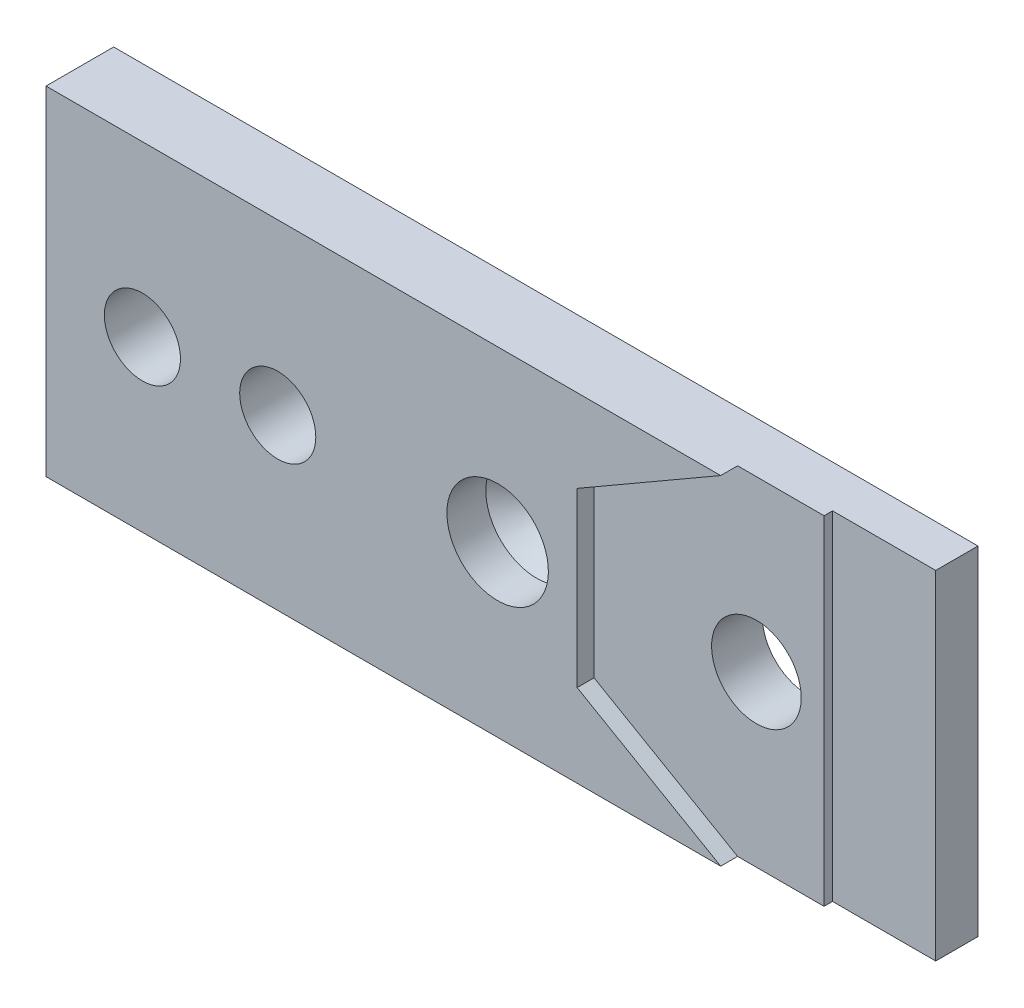
ISO-10303-21;
HEADER;
FILE_DESCRIPTION(('STEP AP214'),'2;1');
FILE_NAME('part.step','',(''),(''),'','','');
FILE_SCHEMA(('AUTOMOTIVE_DESIGN { 1 0 10303 214 1 1 1 1 }'));
ENDSEC;
DATA;
#1=APPLICATION_CONTEXT('core data for automotive mechanical design processes');
#2=APPLICATION_PROTOCOL_DEFINITION('international standard','automotive_design',2000,#1);
#3=PRODUCT_CONTEXT('',#1,'mechanical');
#4=PRODUCT('Part','Part','',(#3));
#5=PRODUCT_RELATED_PRODUCT_CATEGORY('part','',(#4));
#6=PRODUCT_DEFINITION_FORMATION('','',#4);
#7=PRODUCT_DEFINITION_CONTEXT('part definition',#1,'design');
#8=PRODUCT_DEFINITION('design','',#6,#7);
#9=PRODUCT_DEFINITION_SHAPE('','',#8);
#10=(LENGTH_UNIT() NAMED_UNIT(*) SI_UNIT(.MILLI.,.METRE.));
#11=(NAMED_UNIT(*) PLANE_ANGLE_UNIT() SI_UNIT($,.RADIAN.));
#12=(NAMED_UNIT(*) SI_UNIT($,.STERADIAN.) SOLID_ANGLE_UNIT());
#13=UNCERTAINTY_MEASURE_WITH_UNIT(LENGTH_MEASURE(1.E-05),#10,'distance_accuracy_value','');
#14=(GEOMETRIC_REPRESENTATION_CONTEXT(3) GLOBAL_UNCERTAINTY_ASSIGNED_CONTEXT((#13)) GLOBAL_UNIT_ASSIGNED_CONTEXT((#10,
#11,#12)) REPRESENTATION_CONTEXT('',''));
#15=CARTESIAN_POINT('',(0.,0.,0.));
#16=DIRECTION('',(0.,0.,1.));
#17=DIRECTION('',(1.,0.,0.));
#18=AXIS2_PLACEMENT_3D('',#15,#16,#17);
#19=CARTESIAN_POINT('',(26.7,1.49999999998826,18.9953318805774));
#20=DIRECTION('',(0.,1.30506716544687E-12,-1.));
#21=DIRECTION('',(0.,1.,1.30506716544687E-12));
#22=AXIS2_PLACEMENT_3D('',#19,#20,#21);
#23=CYLINDRICAL_SURFACE('',#22,1.65);
#24=CARTESIAN_POINT('',(26.7,1.50000000000196,8.49999999999999));
#25=DIRECTION('',(0.,1.30506716544687E-12,-1.));
#26=DIRECTION('',(0.,1.,1.30506716544687E-12));
#27=AXIS2_PLACEMENT_3D('',#24,#25,#26);
#28=CIRCLE('',#27,1.65);
#29=CARTESIAN_POINT('',(26.7,3.15000000000196,8.50000000000215));
#30=VERTEX_POINT('',#29);
#31=EDGE_CURVE('E194',#30,#30,#28,.T.);
#32=ORIENTED_EDGE('',*,*,#31,.T.);
#33=EDGE_LOOP('',(#32));
#34=FACE_BOUND('',#33,.T.);
#35=CARTESIAN_POINT('',(26.7,1.5000000000015,8.84999999999999));
#36=DIRECTION('',(0.,-1.30506716544687E-12,1.));
#37=DIRECTION('',(0.,-1.,-1.30506716544687E-12));
#38=AXIS2_PLACEMENT_3D('',#35,#36,#37);
#39=CIRCLE('',#38,1.65);
#40=CARTESIAN_POINT('',(26.7,-0.149999999998496,8.84999999999784));
#41=VERTEX_POINT('',#40);
#42=EDGE_CURVE('E39',#41,#41,#39,.F.);
#43=ORIENTED_EDGE('',*,*,#42,.F.);
#44=EDGE_LOOP('',(#43));
#45=FACE_BOUND('',#44,.T.);
#46=ADVANCED_FACE('F35',(#34,#45),#23,.F.);
#47=CARTESIAN_POINT('',(0.,-8.50000000000326,12.4999999999869));
#48=DIRECTION('',(0.,-1.30506716544687E-12,1.));
#49=DIRECTION('',(0.,-1.,-1.30506716544687E-12));
#50=AXIS2_PLACEMENT_3D('',#47,#48,#49);
#51=PLANE('',#50);
#52=DIRECTION('',(0.,-1.,-1.30506716544687E-12));
#53=VECTOR('',#52,1.);
#54=CARTESIAN_POINT('',(0.,1.51831648704547,12.5));
#55=LINE('',#54,#53);
#56=CARTESIAN_POINT('',(0.,11.4999999999967,12.500000000013));
#57=VERTEX_POINT('',#56);
#58=CARTESIAN_POINT('',(0.,-8.50000000000326,12.4999999999869));
#59=VERTEX_POINT('',#58);
#60=EDGE_CURVE('E165',#57,#59,#55,.T.);
#61=ORIENTED_EDGE('',*,*,#60,.T.);
#62=DIRECTION('',(1.,0.,0.));
#63=VECTOR('',#62,1.);
#64=CARTESIAN_POINT('',(-17.0919216022043,-8.50000000000326,12.4999999999869));
#65=LINE('',#64,#63);
#66=CARTESIAN_POINT('',(39.8870489570875,-8.50000000000326,12.4999999999869));
#67=VERTEX_POINT('',#66);
#68=EDGE_CURVE('E160',#59,#67,#65,.T.);
#69=ORIENTED_EDGE('',*,*,#68,.T.);
#70=DIRECTION('',(0.86602540378444,-0.499999999999997,-6.52533582723432E-13));
#71=VECTOR('',#70,1.);
#72=CARTESIAN_POINT('',(-7.18523725284984,18.677197114675,12.5000000000224));
#73=LINE('',#72,#71);
#74=CARTESIAN_POINT('',(31.4,-3.60000000000326,12.4999999999933));
#75=VERTEX_POINT('',#74);
#76=EDGE_CURVE('E149',#75,#67,#73,.T.);
#77=ORIENTED_EDGE('',*,*,#76,.F.);
#78=DIRECTION('',(0.,-1.,-1.30506716544687E-12));
#79=VECTOR('',#78,1.);
#80=CARTESIAN_POINT('',(31.4,1.51831648704547,12.5));
#81=LINE('',#80,#79);
#82=CARTESIAN_POINT('',(31.4,6.59999999999674,12.5000000000067));
#83=VERTEX_POINT('',#82);
#84=EDGE_CURVE('E148',#83,#75,#81,.T.);
#85=ORIENTED_EDGE('',*,*,#84,.F.);
#86=DIRECTION('',(-0.86602540378444,-0.499999999999998,-6.52533582723433E-13));
#87=VECTOR('',#86,1.);
#88=CARTESIAN_POINT('',(-7.16937470975751,-15.6680388711572,12.4999999999776));
#89=LINE('',#88,#87);
#90=CARTESIAN_POINT('',(39.8870489570875,11.4999999999967,12.500000000013));
#91=VERTEX_POINT('',#90);
#92=EDGE_CURVE('E170',#91,#83,#89,.T.);
#93=ORIENTED_EDGE('',*,*,#92,.F.);
#94=DIRECTION('',(-1.,0.,0.));
#95=VECTOR('',#94,1.);
#96=CARTESIAN_POINT('',(-17.0919216022043,11.4999999999967,12.500000000013));
#97=LINE('',#96,#95);
#98=EDGE_CURVE('E164',#91,#57,#97,.T.);
#99=ORIENTED_EDGE('',*,*,#98,.T.);
#100=EDGE_LOOP('',(#61,#69,#77,#85,#93,#99));
#101=FACE_BOUND('',#100,.T.);
#102=CARTESIAN_POINT('',(13.7,1.49999999999674,12.5));
#103=DIRECTION('',(0.,-1.30506716544687E-12,1.));
#104=DIRECTION('',(0.,-1.,-1.30506716544687E-12));
#105=AXIS2_PLACEMENT_3D('',#102,#103,#104);
#106=CIRCLE('',#105,2.25);
#107=CARTESIAN_POINT('',(13.7,-0.750000000003261,12.4999999999971));
#108=VERTEX_POINT('',#107);
#109=EDGE_CURVE('E156',#108,#108,#106,.F.);
#110=ORIENTED_EDGE('',*,*,#109,.T.);
#111=EDGE_LOOP('',(#110));
#112=FACE_BOUND('',#111,.T.);
#113=CARTESIAN_POINT('',(5.69999999999999,1.49999999999674,12.5));
#114=DIRECTION('',(0.,-1.30506716544687E-12,1.));
#115=DIRECTION('',(0.,-1.,-1.30506716544687E-12));
#116=AXIS2_PLACEMENT_3D('',#113,#114,#115);
#117=CIRCLE('',#116,2.25);
#118=CARTESIAN_POINT('',(5.69999999999999,-0.750000000003259,12.4999999999971));
#119=VERTEX_POINT('',#118);
#120=EDGE_CURVE('E161',#119,#119,#117,.F.);
#121=ORIENTED_EDGE('',*,*,#120,.T.);
#122=EDGE_LOOP('',(#121));
#123=FACE_BOUND('',#122,.T.);
#124=CARTESIAN_POINT('',(26.7,1.49999999999674,12.5));
#125=DIRECTION('',(0.,1.30506716544687E-12,-1.));
#126=DIRECTION('',(0.,1.,1.30506716544687E-12));
#127=AXIS2_PLACEMENT_3D('',#124,#125,#126);
#128=CIRCLE('',#127,3.);
#129=CARTESIAN_POINT('',(26.7,4.49999999999674,12.5000000000039));
#130=VERTEX_POINT('',#129);
#131=EDGE_CURVE('E479',#130,#130,#128,.T.);
#132=ORIENTED_EDGE('',*,*,#131,.T.);
#133=EDGE_LOOP('',(#132));
#134=FACE_BOUND('',#133,.T.);
#135=ADVANCED_FACE('F248',(#101,#112,#123,#134),#51,.T.);
#136=CARTESIAN_POINT('',(0.,-8.50000000000195,11.4999999999869));
#137=DIRECTION('',(1.,0.,0.));
#138=DIRECTION('',(0.,-1.30506716544687E-12,1.));
#139=AXIS2_PLACEMENT_3D('',#136,#137,#138);
#140=PLANE('',#139);
#141=DIRECTION('',(0.,1.30506716544687E-12,-1.));
#142=VECTOR('',#141,1.);
#143=CARTESIAN_POINT('',(0.,11.499999999998,11.500000000013));
#144=LINE('',#143,#142);
#145=CARTESIAN_POINT('',(0.,11.500000000002,8.50000000001305));
#146=VERTEX_POINT('',#145);
#147=EDGE_CURVE('E126',#57,#146,#144,.T.);
#148=ORIENTED_EDGE('',*,*,#147,.T.);
#149=DIRECTION('',(0.,1.,1.30506716544687E-12));
#150=VECTOR('',#149,1.);
#151=CARTESIAN_POINT('',(0.,-8.49999999999804,8.49999999998695));
#152=LINE('',#151,#150);
#153=CARTESIAN_POINT('',(0.,-8.49999999999804,8.49999999998695));
#154=VERTEX_POINT('',#153);
#155=EDGE_CURVE('E12',#154,#146,#152,.T.);
#156=ORIENTED_EDGE('',*,*,#155,.F.);
#157=DIRECTION('',(0.,1.30506716544687E-12,-1.));
#158=VECTOR('',#157,1.);
#159=CARTESIAN_POINT('',(0.,-8.50000000000195,11.4999999999869));
#160=LINE('',#159,#158);
#161=EDGE_CURVE('E197',#59,#154,#160,.T.);
#162=ORIENTED_EDGE('',*,*,#161,.F.);
#163=ORIENTED_EDGE('',*,*,#60,.F.);
#164=EDGE_LOOP('',(#148,#156,#162,#163));
#165=FACE_BOUND('',#164,.T.);
#166=ADVANCED_FACE('F37',(#165),#140,.F.);
#167=CARTESIAN_POINT('',(0.,-8.49999999999804,8.49999999998695));
#168=DIRECTION('',(0.,-1.30506716544687E-12,1.));
#169=DIRECTION('',(0.,-1.,-1.30506716544687E-12));
#170=AXIS2_PLACEMENT_3D('',#167,#168,#169);
#171=PLANE('',#170);
#172=CARTESIAN_POINT('',(5.69999999999999,1.50000000000196,8.49999999999999));
#173=DIRECTION('',(0.,1.30506716544687E-12,-1.));
#174=DIRECTION('',(0.,1.,1.30506716544687E-12));
#175=AXIS2_PLACEMENT_3D('',#172,#173,#174);
#176=CIRCLE('',#175,2.25);
#177=CARTESIAN_POINT('',(5.69999999999999,3.75000000000196,8.50000000000293));
#178=VERTEX_POINT('',#177);
#179=EDGE_CURVE('E159',#178,#178,#176,.T.);
#180=ORIENTED_EDGE('',*,*,#179,.F.);
#181=EDGE_LOOP('',(#180));
#182=FACE_BOUND('',#181,.T.);
#183=CARTESIAN_POINT('',(13.7,1.50000000000196,8.49999999999999));
#184=DIRECTION('',(0.,1.30506716544687E-12,-1.));
#185=DIRECTION('',(0.,1.,1.30506716544687E-12));
#186=AXIS2_PLACEMENT_3D('',#183,#184,#185);
#187=CIRCLE('',#186,2.25);
#188=CARTESIAN_POINT('',(13.7,3.75000000000196,8.50000000000293));
#189=VERTEX_POINT('',#188);
#190=EDGE_CURVE('E185',#189,#189,#187,.T.);
#191=ORIENTED_EDGE('',*,*,#190,.F.);
#192=EDGE_LOOP('',(#191));
#193=FACE_BOUND('',#192,.T.);
#194=CARTESIAN_POINT('',(41.,1.50000000000196,8.49999999999999));
#195=DIRECTION('',(0.,1.30506716544687E-12,-1.));
#196=DIRECTION('',(0.,1.,1.30506716544687E-12));
#197=AXIS2_PLACEMENT_3D('',#194,#195,#196);
#198=CIRCLE('',#197,2.65);
#199=CARTESIAN_POINT('',(41.,4.15000000000196,8.50000000000346));
#200=VERTEX_POINT('',#199);
#201=EDGE_CURVE('E188',#200,#200,#198,.T.);
#202=ORIENTED_EDGE('',*,*,#201,.F.);
#203=EDGE_LOOP('',(#202));
#204=FACE_BOUND('',#203,.T.);
#205=ORIENTED_EDGE('',*,*,#31,.F.);
#206=EDGE_LOOP('',(#205));
#207=FACE_BOUND('',#206,.T.);
#208=DIRECTION('',(1.,0.,0.));
#209=VECTOR('',#208,1.);
#210=CARTESIAN_POINT('',(0.,11.500000000002,8.50000000001305));
#211=LINE('',#210,#209);
#212=CARTESIAN_POINT('',(51.1,11.500000000002,8.50000000001305));
#213=VERTEX_POINT('',#212);
#214=EDGE_CURVE('E216',#146,#213,#211,.T.);
#215=ORIENTED_EDGE('',*,*,#214,.T.);
#216=DIRECTION('',(0.,1.,1.30506716544687E-12));
#217=VECTOR('',#216,1.);
#218=CARTESIAN_POINT('',(51.1,-8.49999999999804,8.49999999998695));
#219=LINE('',#218,#217);
#220=CARTESIAN_POINT('',(51.1,-8.49999999999804,8.49999999998695));
#221=VERTEX_POINT('',#220);
#222=EDGE_CURVE('E44',#221,#213,#219,.T.);
#223=ORIENTED_EDGE('',*,*,#222,.F.);
#224=DIRECTION('',(1.,0.,0.));
#225=VECTOR('',#224,1.);
#226=CARTESIAN_POINT('',(0.,-8.49999999999804,8.49999999998695));
#227=LINE('',#226,#225);
#228=EDGE_CURVE('E93',#154,#221,#227,.T.);
#229=ORIENTED_EDGE('',*,*,#228,.F.);
#230=ORIENTED_EDGE('',*,*,#155,.T.);
#231=EDGE_LOOP('',(#215,#223,#229,#230));
#232=FACE_BOUND('',#231,.T.);
#233=ADVANCED_FACE('F291',(#182,#193,#204,#207,#232),#171,.F.);
#234=CARTESIAN_POINT('',(51.1,-8.49999999999804,8.49999999998695));
#235=DIRECTION('',(-1.,0.,0.));
#236=DIRECTION('',(0.,1.30506716544687E-12,-1.));
#237=AXIS2_PLACEMENT_3D('',#234,#235,#236);
#238=PLANE('',#237);
#239=DIRECTION('',(0.,-1.30506716544687E-12,1.));
#240=VECTOR('',#239,1.);
#241=CARTESIAN_POINT('',(51.1,11.500000000002,8.50000000001305));
#242=LINE('',#241,#240);
#243=CARTESIAN_POINT('',(51.1,11.4999999999987,11.000000000013));
#244=VERTEX_POINT('',#243);
#245=EDGE_CURVE('E113',#213,#244,#242,.T.);
#246=ORIENTED_EDGE('',*,*,#245,.T.);
#247=DIRECTION('',(0.,1.,1.30506716544687E-12));
#248=VECTOR('',#247,1.);
#249=CARTESIAN_POINT('',(51.1,-8.5000000000013,10.9999999999869));
#250=LINE('',#249,#248);
#251=CARTESIAN_POINT('',(51.1,-8.5000000000013,10.9999999999869));
#252=VERTEX_POINT('',#251);
#253=EDGE_CURVE('E110',#252,#244,#250,.T.);
#254=ORIENTED_EDGE('',*,*,#253,.F.);
#255=DIRECTION('',(0.,-1.30506716544687E-12,1.));
#256=VECTOR('',#255,1.);
#257=CARTESIAN_POINT('',(51.1,-8.49999999999804,8.49999999998695));
#258=LINE('',#257,#256);
#259=EDGE_CURVE('E100',#221,#252,#258,.T.);
#260=ORIENTED_EDGE('',*,*,#259,.F.);
#261=ORIENTED_EDGE('',*,*,#222,.T.);
#262=EDGE_LOOP('',(#246,#254,#260,#261));
#263=FACE_BOUND('',#262,.T.);
#264=ADVANCED_FACE('F111',(#263),#238,.F.);
#265=CARTESIAN_POINT('',(51.1,-8.5000000000013,10.9999999999869));
#266=DIRECTION('',(0.,1.30506716544687E-12,-1.));
#267=DIRECTION('',(1.,0.,0.));
#268=AXIS2_PLACEMENT_3D('',#265,#266,#267);
#269=PLANE('',#268);
#270=DIRECTION('',(-1.,0.,0.));
#271=VECTOR('',#270,1.);
#272=CARTESIAN_POINT('',(51.1,11.4999999999987,11.000000000013));
#273=LINE('',#272,#271);
#274=CARTESIAN_POINT('',(45.,11.4999999999987,11.000000000013));
#275=VERTEX_POINT('',#274);
#276=EDGE_CURVE('E205',#244,#275,#273,.T.);
#277=ORIENTED_EDGE('',*,*,#276,.T.);
#278=DIRECTION('',(0.,1.,1.30506716544687E-12));
#279=VECTOR('',#278,1.);
#280=CARTESIAN_POINT('',(45.,-8.5000000000013,10.9999999999869));
#281=LINE('',#280,#279);
#282=CARTESIAN_POINT('',(45.,-8.5000000000013,10.9999999999869));
#283=VERTEX_POINT('',#282);
#284=EDGE_CURVE('E116',#283,#275,#281,.T.);
#285=ORIENTED_EDGE('',*,*,#284,.F.);
#286=DIRECTION('',(-1.,0.,0.));
#287=VECTOR('',#286,1.);
#288=CARTESIAN_POINT('',(51.1,-8.5000000000013,10.9999999999869));
#289=LINE('',#288,#287);
#290=EDGE_CURVE('E104',#252,#283,#289,.T.);
#291=ORIENTED_EDGE('',*,*,#290,.F.);
#292=ORIENTED_EDGE('',*,*,#253,.T.);
#293=EDGE_LOOP('',(#277,#285,#291,#292));
#294=FACE_BOUND('',#293,.T.);
#295=ADVANCED_FACE('F118',(#294),#269,.F.);
#296=CARTESIAN_POINT('',(45.,-8.5000000000013,10.9999999999869));
#297=DIRECTION('',(-1.,0.,0.));
#298=DIRECTION('',(0.,-1.,-1.30506716544687E-12));
#299=AXIS2_PLACEMENT_3D('',#296,#297,#298);
#300=PLANE('',#299);
#301=DIRECTION('',(0.,-1.30506716544687E-12,1.));
#302=VECTOR('',#301,1.);
#303=CARTESIAN_POINT('',(45.,11.4999999999987,11.000000000013));
#304=LINE('',#303,#302);
#305=CARTESIAN_POINT('',(45.,11.499999999998,11.5000000000131));
#306=VERTEX_POINT('',#305);
#307=EDGE_CURVE('E85',#275,#306,#304,.T.);
#308=ORIENTED_EDGE('',*,*,#307,.T.);
#309=DIRECTION('',(0.,1.,1.30506716544687E-12));
#310=VECTOR('',#309,1.);
#311=CARTESIAN_POINT('',(45.,-8.50000000000195,11.4999999999869));
#312=LINE('',#311,#310);
#313=CARTESIAN_POINT('',(45.,-8.50000000000195,11.4999999999869));
#314=VERTEX_POINT('',#313);
#315=EDGE_CURVE('E131',#314,#306,#312,.T.);
#316=ORIENTED_EDGE('',*,*,#315,.F.);
#317=DIRECTION('',(0.,-1.30506716544687E-12,1.));
#318=VECTOR('',#317,1.);
#319=CARTESIAN_POINT('',(45.,-8.5000000000013,10.9999999999869));
#320=LINE('',#319,#318);
#321=EDGE_CURVE('E61',#283,#314,#320,.T.);
#322=ORIENTED_EDGE('',*,*,#321,.F.);
#323=ORIENTED_EDGE('',*,*,#284,.T.);
#324=EDGE_LOOP('',(#308,#316,#322,#323));
#325=FACE_BOUND('',#324,.T.);
#326=ADVANCED_FACE('F284',(#325),#300,.F.);
#327=CARTESIAN_POINT('',(45.,-8.50000000000195,11.4999999999869));
#328=DIRECTION('',(0.,1.30506716544687E-12,-1.));
#329=DIRECTION('',(1.,0.,0.));
#330=AXIS2_PLACEMENT_3D('',#327,#328,#329);
#331=PLANE('',#330);
#332=CARTESIAN_POINT('',(41.,1.49999999999804,11.5));
#333=DIRECTION('',(0.,1.30506716544687E-12,-1.));
#334=DIRECTION('',(1.,0.,0.));
#335=AXIS2_PLACEMENT_3D('',#332,#333,#334);
#336=CIRCLE('',#335,2.65);
#337=CARTESIAN_POINT('',(43.65,1.49999999999804,11.5));
#338=VERTEX_POINT('',#337);
#339=EDGE_CURVE('E191',#338,#338,#336,.F.);
#340=ORIENTED_EDGE('',*,*,#339,.F.);
#341=EDGE_LOOP('',(#340));
#342=FACE_BOUND('',#341,.T.);
#343=DIRECTION('',(0.,-1.,-1.30506716544687E-12));
#344=VECTOR('',#343,1.);
#345=CARTESIAN_POINT('',(31.4,1.51831648704677,11.5));
#346=LINE('',#345,#344);
#347=CARTESIAN_POINT('',(31.4,6.59999999999804,11.5000000000067));
#348=VERTEX_POINT('',#347);
#349=CARTESIAN_POINT('',(31.4,-3.60000000000195,11.4999999999933));
#350=VERTEX_POINT('',#349);
#351=EDGE_CURVE('E143',#348,#350,#346,.T.);
#352=ORIENTED_EDGE('',*,*,#351,.T.);
#353=DIRECTION('',(0.86602540378444,-0.499999999999997,-6.524376327347E-13));
#354=VECTOR('',#353,1.);
#355=CARTESIAN_POINT('',(-7.18523725284983,18.6771971146763,11.5000000000224));
#356=LINE('',#355,#354);
#357=CARTESIAN_POINT('',(39.8870489570875,-8.50000000000195,11.4999999999869));
#358=VERTEX_POINT('',#357);
#359=EDGE_CURVE('E52',#350,#358,#356,.T.);
#360=ORIENTED_EDGE('',*,*,#359,.T.);
#361=DIRECTION('',(-1.,0.,0.));
#362=VECTOR('',#361,1.);
#363=CARTESIAN_POINT('',(45.,-8.50000000000195,11.4999999999869));
#364=LINE('',#363,#362);
#365=EDGE_CURVE('E120',#314,#358,#364,.T.);
#366=ORIENTED_EDGE('',*,*,#365,.F.);
#367=ORIENTED_EDGE('',*,*,#315,.T.);
#368=DIRECTION('',(-1.,0.,0.));
#369=VECTOR('',#368,1.);
#370=CARTESIAN_POINT('',(45.,11.499999999998,11.5000000000131));
#371=LINE('',#370,#369);
#372=CARTESIAN_POINT('',(39.8870489570875,11.499999999998,11.5000000000131));
#373=VERTEX_POINT('',#372);
#374=EDGE_CURVE('E132',#306,#373,#371,.T.);
#375=ORIENTED_EDGE('',*,*,#374,.T.);
#376=DIRECTION('',(-0.86602540378444,-0.499999999999998,-6.52629532712166E-13));
#377=VECTOR('',#376,1.);
#378=CARTESIAN_POINT('',(-7.16937470975751,-15.6680388711559,11.4999999999776));
#379=LINE('',#378,#377);
#380=EDGE_CURVE('E140',#373,#348,#379,.T.);
#381=ORIENTED_EDGE('',*,*,#380,.T.);
#382=EDGE_LOOP('',(#352,#360,#366,#367,#375,#381));
#383=FACE_BOUND('',#382,.T.);
#384=ADVANCED_FACE('F252',(#342,#383),#331,.F.);
#385=CARTESIAN_POINT('',(0.,-8.49999999999804,8.49999999998695));
#386=DIRECTION('',(0.,-1.,-1.30506716544687E-12));
#387=DIRECTION('',(1.,0.,0.));
#388=AXIS2_PLACEMENT_3D('',#385,#386,#387);
#389=PLANE('',#388);
#390=ORIENTED_EDGE('',*,*,#161,.T.);
#391=ORIENTED_EDGE('',*,*,#228,.T.);
#392=ORIENTED_EDGE('',*,*,#259,.T.);
#393=ORIENTED_EDGE('',*,*,#290,.T.);
#394=ORIENTED_EDGE('',*,*,#321,.T.);
#395=ORIENTED_EDGE('',*,*,#365,.T.);
#396=DIRECTION('',(0.,1.30506716544687E-12,-1.));
#397=VECTOR('',#396,1.);
#398=CARTESIAN_POINT('',(39.8870489570875,-8.50000000006906,62.9168597637996));
#399=LINE('',#398,#397);
#400=EDGE_CURVE('E146',#67,#358,#399,.T.);
#401=ORIENTED_EDGE('',*,*,#400,.F.);
#402=ORIENTED_EDGE('',*,*,#68,.F.);
#403=EDGE_LOOP('',(#390,#391,#392,#393,#394,#395,#401,#402));
#404=FACE_BOUND('',#403,.T.);
#405=ADVANCED_FACE('F102',(#404),#389,.T.);
#406=CARTESIAN_POINT('',(0.,11.500000000002,8.50000000001305));
#407=DIRECTION('',(0.,-1.,-1.30506716544687E-12));
#408=DIRECTION('',(1.,0.,0.));
#409=AXIS2_PLACEMENT_3D('',#406,#407,#408);
#410=PLANE('',#409);
#411=ORIENTED_EDGE('',*,*,#147,.F.);
#412=ORIENTED_EDGE('',*,*,#98,.F.);
#413=DIRECTION('',(0.,1.30506716544687E-12,-1.));
#414=VECTOR('',#413,1.);
#415=CARTESIAN_POINT('',(39.8870489570875,11.4999999999309,62.9168597638257));
#416=LINE('',#415,#414);
#417=EDGE_CURVE('E134',#91,#373,#416,.T.);
#418=ORIENTED_EDGE('',*,*,#417,.T.);
#419=ORIENTED_EDGE('',*,*,#374,.F.);
#420=ORIENTED_EDGE('',*,*,#307,.F.);
#421=ORIENTED_EDGE('',*,*,#276,.F.);
#422=ORIENTED_EDGE('',*,*,#245,.F.);
#423=ORIENTED_EDGE('',*,*,#214,.F.);
#424=EDGE_LOOP('',(#411,#412,#418,#419,#420,#421,#422,#423));
#425=FACE_BOUND('',#424,.T.);
#426=ADVANCED_FACE('F215',(#425),#410,.F.);
#427=CARTESIAN_POINT('',(41.,1.49999999998826,18.9953318805774));
#428=DIRECTION('',(0.,1.30506716544687E-12,-1.));
#429=DIRECTION('',(0.,1.,1.30506716544687E-12));
#430=AXIS2_PLACEMENT_3D('',#427,#428,#429);
#431=CYLINDRICAL_SURFACE('',#430,2.65);
#432=ORIENTED_EDGE('',*,*,#339,.T.);
#433=EDGE_LOOP('',(#432));
#434=FACE_BOUND('',#433,.T.);
#435=ORIENTED_EDGE('',*,*,#201,.T.);
#436=EDGE_LOOP('',(#435));
#437=FACE_BOUND('',#436,.T.);
#438=ADVANCED_FACE('F276',(#434,#437),#431,.F.);
#439=CARTESIAN_POINT('',(13.7,1.49999999998826,18.9953318805774));
#440=DIRECTION('',(0.,1.30506716544687E-12,-1.));
#441=DIRECTION('',(0.,1.,1.30506716544687E-12));
#442=AXIS2_PLACEMENT_3D('',#439,#440,#441);
#443=CYLINDRICAL_SURFACE('',#442,2.25);
#444=ORIENTED_EDGE('',*,*,#190,.T.);
#445=EDGE_LOOP('',(#444));
#446=FACE_BOUND('',#445,.T.);
#447=ORIENTED_EDGE('',*,*,#109,.F.);
#448=EDGE_LOOP('',(#447));
#449=FACE_BOUND('',#448,.T.);
#450=ADVANCED_FACE('F306',(#446,#449),#443,.F.);
#451=CARTESIAN_POINT('',(5.69999999999999,1.49999999998826,18.9953318805774));
#452=DIRECTION('',(0.,1.30506716544687E-12,-1.));
#453=DIRECTION('',(0.,1.,1.30506716544687E-12));
#454=AXIS2_PLACEMENT_3D('',#451,#452,#453);
#455=CYLINDRICAL_SURFACE('',#454,2.25);
#456=ORIENTED_EDGE('',*,*,#179,.T.);
#457=EDGE_LOOP('',(#456));
#458=FACE_BOUND('',#457,.T.);
#459=ORIENTED_EDGE('',*,*,#120,.F.);
#460=EDGE_LOOP('',(#459));
#461=FACE_BOUND('',#460,.T.);
#462=ADVANCED_FACE('F311',(#458,#461),#455,.F.);
#463=CARTESIAN_POINT('',(-7.18523725284984,18.6771971146092,62.916859763835));
#464=DIRECTION('',(0.499999999999997,0.86602540378444,1.13027927182203E-12));
#465=DIRECTION('',(-0.86602540378444,0.499999999999997,6.52533582723432E-13));
#466=AXIS2_PLACEMENT_3D('',#463,#464,#465);
#467=PLANE('',#466);
#468=DIRECTION('',(0.,1.30506716544687E-12,-1.));
#469=VECTOR('',#468,1.);
#470=CARTESIAN_POINT('',(31.4,-3.60000000006906,62.916859763806));
#471=LINE('',#470,#469);
#472=EDGE_CURVE('E173',#75,#350,#471,.T.);
#473=ORIENTED_EDGE('',*,*,#472,.F.);
#474=ORIENTED_EDGE('',*,*,#76,.T.);
#475=ORIENTED_EDGE('',*,*,#400,.T.);
#476=ORIENTED_EDGE('',*,*,#359,.F.);
#477=EDGE_LOOP('',(#473,#474,#475,#476));
#478=FACE_BOUND('',#477,.T.);
#479=ADVANCED_FACE('F247',(#478),#467,.T.);
#480=CARTESIAN_POINT('',(31.4,1.51831648697967,62.9168597638127));
#481=DIRECTION('',(1.,0.,0.));
#482=DIRECTION('',(0.,-1.30506716544687E-12,1.));
#483=AXIS2_PLACEMENT_3D('',#480,#481,#482);
#484=PLANE('',#483);
#485=DIRECTION('',(0.,1.30506716544687E-12,-1.));
#486=VECTOR('',#485,1.);
#487=CARTESIAN_POINT('',(31.4,6.59999999993094,62.9168597638193));
#488=LINE('',#487,#486);
#489=EDGE_CURVE('E137',#83,#348,#488,.T.);
#490=ORIENTED_EDGE('',*,*,#489,.F.);
#491=ORIENTED_EDGE('',*,*,#84,.T.);
#492=ORIENTED_EDGE('',*,*,#472,.T.);
#493=ORIENTED_EDGE('',*,*,#351,.F.);
#494=EDGE_LOOP('',(#490,#491,#492,#493));
#495=FACE_BOUND('',#494,.T.);
#496=ADVANCED_FACE('F243',(#495),#484,.T.);
#497=CARTESIAN_POINT('',(-7.16937470975751,-15.668038871223,62.9168597637902));
#498=DIRECTION('',(0.499999999999998,-0.86602540378444,-1.13016336602185E-12));
#499=DIRECTION('',(0.86602540378444,0.499999999999998,6.52533582723433E-13));
#500=AXIS2_PLACEMENT_3D('',#497,#498,#499);
#501=PLANE('',#500);
#502=ORIENTED_EDGE('',*,*,#417,.F.);
#503=ORIENTED_EDGE('',*,*,#92,.T.);
#504=ORIENTED_EDGE('',*,*,#489,.T.);
#505=ORIENTED_EDGE('',*,*,#380,.F.);
#506=EDGE_LOOP('',(#502,#503,#504,#505));
#507=FACE_BOUND('',#506,.T.);
#508=ADVANCED_FACE('F253',(#507),#501,.T.);
#509=CARTESIAN_POINT('',(26.7,1.49999999999974,10.2));
#510=DIRECTION('',(0.,-1.30506716544687E-12,1.));
#511=DIRECTION('',(0.,-1.,-1.30506716544687E-12));
#512=AXIS2_PLACEMENT_3D('',#509,#510,#511);
#513=CONICAL_SURFACE('',#512,3.,0.785398163397451);
#514=CARTESIAN_POINT('',(26.7,1.49999999999974,10.2));
#515=DIRECTION('',(0.,1.30506716544687E-12,-1.));
#516=DIRECTION('',(0.,1.,1.30506716544687E-12));
#517=AXIS2_PLACEMENT_3D('',#514,#515,#516);
#518=CIRCLE('',#517,3.);
#519=CARTESIAN_POINT('',(26.7,4.49999999999974,10.2000000000039));
#520=VERTEX_POINT('',#519);
#521=EDGE_CURVE('E476',#520,#520,#518,.T.);
#522=ORIENTED_EDGE('',*,*,#521,.F.);
#523=EDGE_LOOP('',(#522));
#524=FACE_BOUND('',#523,.T.);
#525=ORIENTED_EDGE('',*,*,#42,.T.);
#526=EDGE_LOOP('',(#525));
#527=FACE_BOUND('',#526,.T.);
#528=ADVANCED_FACE('F255',(#524,#527),#513,.F.);
#529=CARTESIAN_POINT('',(26.7,1.5000000000017,8.7));
#530=DIRECTION('',(0.,1.30506716544687E-12,-1.));
#531=DIRECTION('',(0.,1.,1.30506716544687E-12));
#532=AXIS2_PLACEMENT_3D('',#529,#530,#531);
#533=CYLINDRICAL_SURFACE('',#532,3.);
#534=ORIENTED_EDGE('',*,*,#521,.T.);
#535=EDGE_LOOP('',(#534));
#536=FACE_BOUND('',#535,.T.);
#537=ORIENTED_EDGE('',*,*,#131,.F.);
#538=EDGE_LOOP('',(#537));
#539=FACE_BOUND('',#538,.T.);
#540=ADVANCED_FACE('F261',(#536,#539),#533,.F.);
#541=CLOSED_SHELL('',(#46,#135,#166,#233,#264,#295,#326,#384,#405,#426,#438,#450,#462,#479,#496,
#508,#528,#540));
#542=MANIFOLD_SOLID_BREP('B2',#541);
#543=ADVANCED_BREP_SHAPE_REPRESENTATION('',(#18,#542),#14);
#544=SHAPE_DEFINITION_REPRESENTATION(#9,#543);
ENDSEC;
END-ISO-10303-21;
